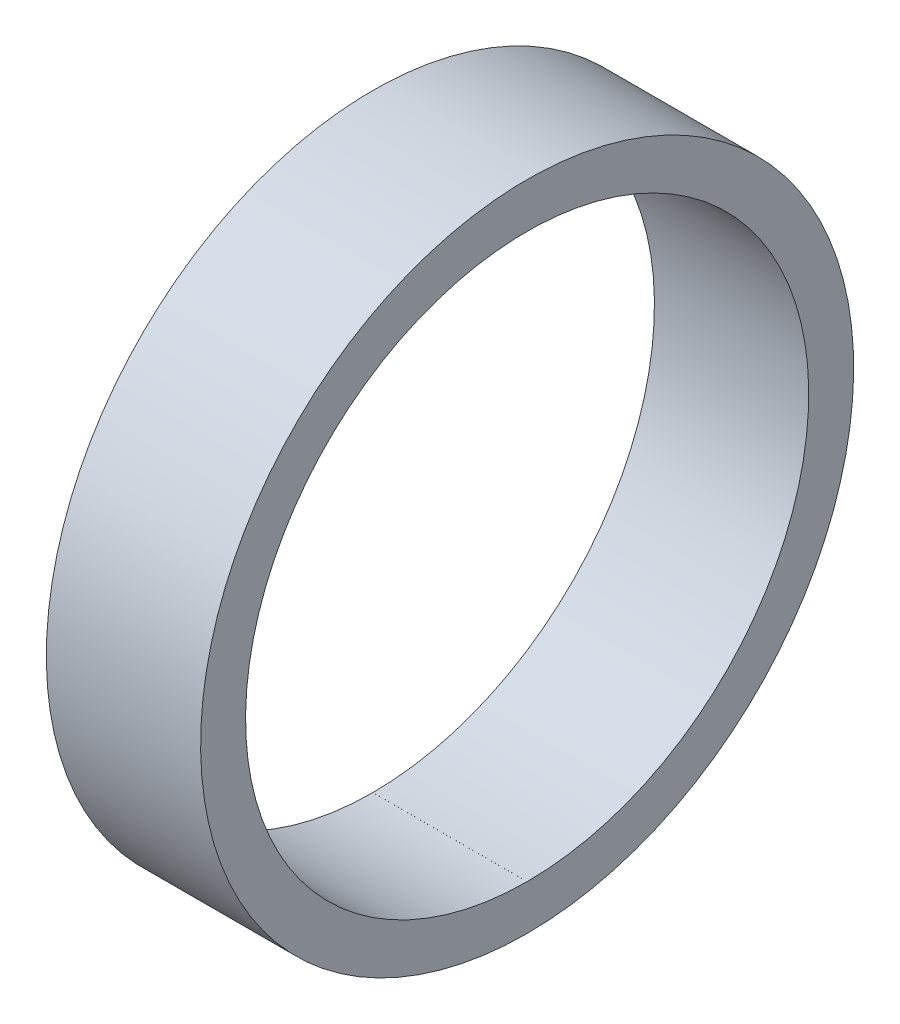
ISO-10303-21;
HEADER;
FILE_DESCRIPTION(('STEP AP214'),'2;1');
FILE_NAME('part.step','',(''),(''),'','','');
FILE_SCHEMA(('AUTOMOTIVE_DESIGN { 1 0 10303 214 1 1 1 1 }'));
ENDSEC;
DATA;
#1=APPLICATION_CONTEXT('core data for automotive mechanical design processes');
#2=APPLICATION_PROTOCOL_DEFINITION('international standard','automotive_design',2000,#1);
#3=PRODUCT_CONTEXT('',#1,'mechanical');
#4=PRODUCT('Part','Part','',(#3));
#5=PRODUCT_RELATED_PRODUCT_CATEGORY('part','',(#4));
#6=PRODUCT_DEFINITION_FORMATION('','',#4);
#7=PRODUCT_DEFINITION_CONTEXT('part definition',#1,'design');
#8=PRODUCT_DEFINITION('design','',#6,#7);
#9=PRODUCT_DEFINITION_SHAPE('','',#8);
#10=(LENGTH_UNIT() NAMED_UNIT(*) SI_UNIT(.MILLI.,.METRE.));
#11=(NAMED_UNIT(*) PLANE_ANGLE_UNIT() SI_UNIT($,.RADIAN.));
#12=(NAMED_UNIT(*) SI_UNIT($,.STERADIAN.) SOLID_ANGLE_UNIT());
#13=UNCERTAINTY_MEASURE_WITH_UNIT(LENGTH_MEASURE(1.E-05),#10,'distance_accuracy_value','');
#14=(GEOMETRIC_REPRESENTATION_CONTEXT(3) GLOBAL_UNCERTAINTY_ASSIGNED_CONTEXT((#13)) GLOBAL_UNIT_ASSIGNED_CONTEXT((#10,
#11,#12)) REPRESENTATION_CONTEXT('',''));
#15=CARTESIAN_POINT('',(0.,0.,0.));
#16=DIRECTION('',(0.,0.,1.));
#17=DIRECTION('',(1.,0.,0.));
#18=AXIS2_PLACEMENT_3D('',#15,#16,#17);
#19=CARTESIAN_POINT('',(0.,47.752,0.));
#20=DIRECTION('',(-1.,0.,0.));
#21=DIRECTION('',(0.,0.,1.));
#22=AXIS2_PLACEMENT_3D('',#19,#20,#21);
#23=CYLINDRICAL_SURFACE('',#22,55.372);
#24=CARTESIAN_POINT('',(0.,47.752,0.));
#25=DIRECTION('',(-1.,0.,0.));
#26=DIRECTION('',(0.,0.,1.));
#27=AXIS2_PLACEMENT_3D('',#24,#25,#26);
#28=CIRCLE('',#27,55.372);
#29=CARTESIAN_POINT('',(0.,-7.61999915663622,0.00966423708430416));
#30=VERTEX_POINT('',#29);
#31=CARTESIAN_POINT('',(0.,-7.62,0.));
#32=VERTEX_POINT('',#31);
#33=EDGE_CURVE('E11',#30,#32,#28,.T.);
#34=ORIENTED_EDGE('',*,*,#33,.F.);
#35=DIRECTION('',(1.,0.,0.));
#36=VECTOR('',#35,1.);
#37=CARTESIAN_POINT('',(0.,-7.61999915663622,0.00966423708430416));
#38=LINE('',#37,#36);
#39=CARTESIAN_POINT('',(26.162,-7.61999915663622,0.00966423708430416));
#40=VERTEX_POINT('',#39);
#41=EDGE_CURVE('E76',#30,#40,#38,.T.);
#42=ORIENTED_EDGE('',*,*,#41,.T.);
#43=CARTESIAN_POINT('',(26.162,47.752,0.));
#44=DIRECTION('',(-1.,0.,0.));
#45=DIRECTION('',(0.,0.,1.));
#46=AXIS2_PLACEMENT_3D('',#43,#44,#45);
#47=CIRCLE('',#46,55.372);
#48=CARTESIAN_POINT('',(26.162,-7.62,0.));
#49=VERTEX_POINT('',#48);
#50=EDGE_CURVE('E71',#40,#49,#47,.T.);
#51=ORIENTED_EDGE('',*,*,#50,.T.);
#52=DIRECTION('',(1.,0.,0.));
#53=VECTOR('',#52,1.);
#54=CARTESIAN_POINT('',(0.,-7.62,0.));
#55=LINE('',#54,#53);
#56=EDGE_CURVE('E74',#32,#49,#55,.T.);
#57=ORIENTED_EDGE('',*,*,#56,.F.);
#58=EDGE_LOOP('',(#34,#42,#51,#57));
#59=FACE_BOUND('',#58,.T.);
#60=ADVANCED_FACE('F35',(#59),#23,.T.);
#61=CARTESIAN_POINT('',(0.,-7.61999915663622,0.00966423708430416));
#62=DIRECTION('',(1.,0.,0.));
#63=DIRECTION('',(0.,0.,-1.));
#64=AXIS2_PLACEMENT_3D('',#61,#62,#63);
#65=PLANE('',#64);
#66=CARTESIAN_POINT('',(0.,47.752,0.));
#67=DIRECTION('',(-1.,0.,0.));
#68=DIRECTION('',(0.,0.,1.));
#69=AXIS2_PLACEMENT_3D('',#66,#67,#68);
#70=CIRCLE('',#69,47.752);
#71=CARTESIAN_POINT('',(0.,7.27304547113228E-07,0.00833429620114304));
#72=VERTEX_POINT('',#71);
#73=CARTESIAN_POINT('',(0.,0.,0.));
#74=VERTEX_POINT('',#73);
#75=EDGE_CURVE('E43',#72,#74,#70,.T.);
#76=ORIENTED_EDGE('',*,*,#75,.F.);
#77=DIRECTION('',(0.,0.999999984769129,-0.00017453292429936));
#78=VECTOR('',#77,1.);
#79=CARTESIAN_POINT('',(0.,-7.61999915663622,0.00966423708430416));
#80=LINE('',#79,#78);
#81=EDGE_CURVE('E81',#30,#72,#80,.T.);
#82=ORIENTED_EDGE('',*,*,#81,.F.);
#83=ORIENTED_EDGE('',*,*,#33,.T.);
#84=DIRECTION('',(0.,1.,0.));
#85=VECTOR('',#84,1.);
#86=CARTESIAN_POINT('',(0.,-7.62,0.));
#87=LINE('',#86,#85);
#88=EDGE_CURVE('E93',#32,#74,#87,.T.);
#89=ORIENTED_EDGE('',*,*,#88,.T.);
#90=EDGE_LOOP('',(#76,#82,#83,#89));
#91=FACE_BOUND('',#90,.T.);
#92=ADVANCED_FACE('F37',(#91),#65,.F.);
#93=CARTESIAN_POINT('',(0.,47.752,0.));
#94=DIRECTION('',(-1.,0.,0.));
#95=DIRECTION('',(0.,0.,1.));
#96=AXIS2_PLACEMENT_3D('',#93,#94,#95);
#97=CYLINDRICAL_SURFACE('',#96,47.752);
#98=CARTESIAN_POINT('',(26.162,47.752,0.));
#99=DIRECTION('',(-1.,0.,0.));
#100=DIRECTION('',(0.,0.,1.));
#101=AXIS2_PLACEMENT_3D('',#98,#99,#100);
#102=CIRCLE('',#101,47.752);
#103=CARTESIAN_POINT('',(26.162,7.27304547113228E-07,0.00833429620114304));
#104=VERTEX_POINT('',#103);
#105=CARTESIAN_POINT('',(26.162,0.,0.));
#106=VERTEX_POINT('',#105);
#107=EDGE_CURVE('E80',#104,#106,#102,.T.);
#108=ORIENTED_EDGE('',*,*,#107,.F.);
#109=DIRECTION('',(1.,0.,0.));
#110=VECTOR('',#109,1.);
#111=CARTESIAN_POINT('',(0.,7.27304547113228E-07,0.00833429620114304));
#112=LINE('',#111,#110);
#113=EDGE_CURVE('E101',#72,#104,#112,.T.);
#114=ORIENTED_EDGE('',*,*,#113,.F.);
#115=ORIENTED_EDGE('',*,*,#75,.T.);
#116=DIRECTION('',(1.,0.,0.));
#117=VECTOR('',#116,1.);
#118=CARTESIAN_POINT('',(0.,0.,0.));
#119=LINE('',#118,#117);
#120=EDGE_CURVE('E89',#74,#106,#119,.T.);
#121=ORIENTED_EDGE('',*,*,#120,.T.);
#122=EDGE_LOOP('',(#108,#114,#115,#121));
#123=FACE_BOUND('',#122,.T.);
#124=ADVANCED_FACE('F107',(#123),#97,.F.);
#125=CARTESIAN_POINT('',(26.162,7.27304547113228E-07,0.00833429620114304));
#126=DIRECTION('',(-1.,0.,0.));
#127=DIRECTION('',(0.,0.,1.));
#128=AXIS2_PLACEMENT_3D('',#125,#126,#127);
#129=PLANE('',#128);
#130=DIRECTION('',(0.,-0.999999984769129,0.00017453292429936));
#131=VECTOR('',#130,1.);
#132=CARTESIAN_POINT('',(26.162,7.27304547113228E-07,0.00833429620114304));
#133=LINE('',#132,#131);
#134=EDGE_CURVE('E99',#104,#40,#133,.T.);
#135=ORIENTED_EDGE('',*,*,#134,.F.);
#136=ORIENTED_EDGE('',*,*,#107,.T.);
#137=DIRECTION('',(0.,-1.,0.));
#138=VECTOR('',#137,1.);
#139=CARTESIAN_POINT('',(26.162,0.,0.));
#140=LINE('',#139,#138);
#141=EDGE_CURVE('E84',#106,#49,#140,.T.);
#142=ORIENTED_EDGE('',*,*,#141,.T.);
#143=ORIENTED_EDGE('',*,*,#50,.F.);
#144=EDGE_LOOP('',(#135,#136,#142,#143));
#145=FACE_BOUND('',#144,.T.);
#146=ADVANCED_FACE('F85',(#145),#129,.F.);
#147=CARTESIAN_POINT('',(0.,7.27304547113228E-07,0.00833429620114304));
#148=DIRECTION('',(0.,-0.00017453292429936,-0.999999984769129));
#149=DIRECTION('',(-1.,0.,0.));
#150=AXIS2_PLACEMENT_3D('',#147,#148,#149);
#151=PLANE('',#150);
#152=ORIENTED_EDGE('',*,*,#41,.F.);
#153=ORIENTED_EDGE('',*,*,#81,.T.);
#154=ORIENTED_EDGE('',*,*,#113,.T.);
#155=ORIENTED_EDGE('',*,*,#134,.T.);
#156=EDGE_LOOP('',(#152,#153,#154,#155));
#157=FACE_BOUND('',#156,.T.);
#158=ADVANCED_FACE('F109',(#157),#151,.T.);
#159=CARTESIAN_POINT('',(0.,0.,0.));
#160=DIRECTION('',(0.,0.,-1.));
#161=DIRECTION('',(-1.,0.,0.));
#162=AXIS2_PLACEMENT_3D('',#159,#160,#161);
#163=PLANE('',#162);
#164=ORIENTED_EDGE('',*,*,#56,.T.);
#165=ORIENTED_EDGE('',*,*,#141,.F.);
#166=ORIENTED_EDGE('',*,*,#120,.F.);
#167=ORIENTED_EDGE('',*,*,#88,.F.);
#168=EDGE_LOOP('',(#164,#165,#166,#167));
#169=FACE_BOUND('',#168,.T.);
#170=ADVANCED_FACE('F92',(#169),#163,.F.);
#171=CLOSED_SHELL('',(#60,#92,#124,#146,#158,#170));
#172=MANIFOLD_SOLID_BREP('B2',#171);
#173=ADVANCED_BREP_SHAPE_REPRESENTATION('',(#18,#172),#14);
#174=SHAPE_DEFINITION_REPRESENTATION(#9,#173);
ENDSEC;
END-ISO-10303-21;
